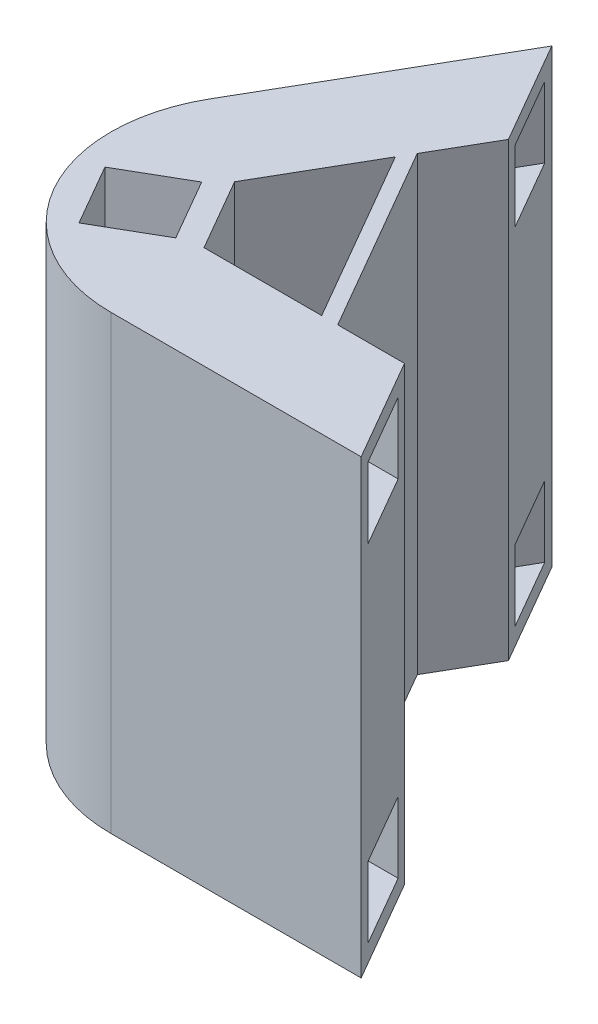
ISO-10303-21;
HEADER;
FILE_DESCRIPTION(('STEP AP214'),'2;1');
FILE_NAME('part.step','',(''),(''),'','','');
FILE_SCHEMA(('AUTOMOTIVE_DESIGN { 1 0 10303 214 1 1 1 1 }'));
ENDSEC;
DATA;
#1=APPLICATION_CONTEXT('core data for automotive mechanical design processes');
#2=APPLICATION_PROTOCOL_DEFINITION('international standard','automotive_design',2000,#1);
#3=PRODUCT_CONTEXT('',#1,'mechanical');
#4=PRODUCT('Part','Part','',(#3));
#5=PRODUCT_RELATED_PRODUCT_CATEGORY('part','',(#4));
#6=PRODUCT_DEFINITION_FORMATION('','',#4);
#7=PRODUCT_DEFINITION_CONTEXT('part definition',#1,'design');
#8=PRODUCT_DEFINITION('design','',#6,#7);
#9=PRODUCT_DEFINITION_SHAPE('','',#8);
#10=(LENGTH_UNIT() NAMED_UNIT(*) SI_UNIT(.MILLI.,.METRE.));
#11=(NAMED_UNIT(*) PLANE_ANGLE_UNIT() SI_UNIT($,.RADIAN.));
#12=(NAMED_UNIT(*) SI_UNIT($,.STERADIAN.) SOLID_ANGLE_UNIT());
#13=UNCERTAINTY_MEASURE_WITH_UNIT(LENGTH_MEASURE(1.E-05),#10,'distance_accuracy_value','');
#14=(GEOMETRIC_REPRESENTATION_CONTEXT(3) GLOBAL_UNCERTAINTY_ASSIGNED_CONTEXT((#13)) GLOBAL_UNIT_ASSIGNED_CONTEXT((#10,
#11,#12)) REPRESENTATION_CONTEXT('',''));
#15=CARTESIAN_POINT('',(0.,0.,0.));
#16=DIRECTION('',(0.,0.,1.));
#17=DIRECTION('',(1.,0.,0.));
#18=AXIS2_PLACEMENT_3D('',#15,#16,#17);
#19=CARTESIAN_POINT('',(132.950773216421,-434.866677038872,-29.5301270189221));
#20=DIRECTION('',(0.,0.,-1.));
#21=DIRECTION('',(-1.,0.,0.));
#22=AXIS2_PLACEMENT_3D('',#19,#20,#21);
#23=PLANE('',#22);
#24=DIRECTION('',(0.,-1.,0.));
#25=VECTOR('',#24,1.);
#26=CARTESIAN_POINT('',(113.725009252406,193.763403112973,-29.5301270189222));
#27=LINE('',#26,#25);
#28=CARTESIAN_POINT('',(113.725009252406,130.,-29.5301270189221));
#29=VERTEX_POINT('',#28);
#30=CARTESIAN_POINT('',(113.725009252406,0.,-29.5301270189222));
#31=VERTEX_POINT('',#30);
#32=EDGE_CURVE('E270',#29,#31,#27,.T.);
#33=ORIENTED_EDGE('',*,*,#32,.F.);
#34=DIRECTION('',(1.,0.,0.));
#35=VECTOR('',#34,1.);
#36=CARTESIAN_POINT('',(0.,130.,-29.5301270189222));
#37=LINE('',#36,#35);
#38=CARTESIAN_POINT('',(132.950773216421,130.,-29.5301270189221));
#39=VERTEX_POINT('',#38);
#40=EDGE_CURVE('E281',#29,#39,#37,.T.);
#41=ORIENTED_EDGE('',*,*,#40,.T.);
#42=DIRECTION('',(0.,1.,0.));
#43=VECTOR('',#42,1.);
#44=CARTESIAN_POINT('',(132.950773216421,-434.866677038872,-29.5301270189221));
#45=LINE('',#44,#43);
#46=CARTESIAN_POINT('',(132.950773216421,0.,-29.5301270189221));
#47=VERTEX_POINT('',#46);
#48=EDGE_CURVE('E252',#47,#39,#45,.T.);
#49=ORIENTED_EDGE('',*,*,#48,.F.);
#50=DIRECTION('',(1.,0.,0.));
#51=VECTOR('',#50,1.);
#52=CARTESIAN_POINT('',(0.,0.,-29.5301270189222));
#53=LINE('',#52,#51);
#54=EDGE_CURVE('E41',#31,#47,#53,.T.);
#55=ORIENTED_EDGE('',*,*,#54,.F.);
#56=EDGE_LOOP('',(#33,#41,#49,#55));
#57=FACE_BOUND('',#56,.T.);
#58=ADVANCED_FACE('F33',(#57),#23,.T.);
#59=CARTESIAN_POINT('',(63.1817133240967,-434.866677038872,-50.3736835487436));
#60=DIRECTION('',(0.866025403784439,0.,0.5));
#61=DIRECTION('',(0.5,0.,-0.866025403784439));
#62=AXIS2_PLACEMENT_3D('',#59,#60,#61);
#63=PLANE('',#62);
#64=DIRECTION('',(0.,-1.,0.));
#65=VECTOR('',#64,1.);
#66=CARTESIAN_POINT('',(82.4363448015707,193.763403112973,-83.7236835487436));
#67=LINE('',#66,#65);
#68=CARTESIAN_POINT('',(82.4363448015707,130.,-83.7236835487436));
#69=VERTEX_POINT('',#68);
#70=CARTESIAN_POINT('',(82.4363448015707,0.,-83.7236835487436));
#71=VERTEX_POINT('',#70);
#72=EDGE_CURVE('E261',#69,#71,#67,.T.);
#73=ORIENTED_EDGE('',*,*,#72,.T.);
#74=DIRECTION('',(-0.5,0.,0.866025403784439));
#75=VECTOR('',#74,1.);
#76=CARTESIAN_POINT('',(25.5738401753674,0.,14.7650635094608));
#77=LINE('',#76,#75);
#78=CARTESIAN_POINT('',(92.049226783578,0.,-100.373683548744));
#79=VERTEX_POINT('',#78);
#80=EDGE_CURVE('E472',#79,#71,#77,.T.);
#81=ORIENTED_EDGE('',*,*,#80,.F.);
#82=DIRECTION('',(0.,1.,0.));
#83=VECTOR('',#82,1.);
#84=CARTESIAN_POINT('',(92.049226783578,-434.866677038872,-100.373683548744));
#85=LINE('',#84,#83);
#86=CARTESIAN_POINT('',(92.049226783578,130.,-100.373683548744));
#87=VERTEX_POINT('',#86);
#88=EDGE_CURVE('E267',#79,#87,#85,.T.);
#89=ORIENTED_EDGE('',*,*,#88,.T.);
#90=DIRECTION('',(-0.5,0.,0.866025403784439));
#91=VECTOR('',#90,1.);
#92=CARTESIAN_POINT('',(25.5738401753674,130.,14.7650635094608));
#93=LINE('',#92,#91);
#94=EDGE_CURVE('E251',#87,#69,#93,.T.);
#95=ORIENTED_EDGE('',*,*,#94,.T.);
#96=EDGE_LOOP('',(#73,#81,#89,#95));
#97=FACE_BOUND('',#96,.T.);
#98=ADVANCED_FACE('F519',(#97),#63,.T.);
#99=CARTESIAN_POINT('',(74.9999999999997,130.,-129.903810567666));
#100=DIRECTION('',(-0.86602540378444,0.,0.499999999999998));
#101=DIRECTION('',(0.499999999999998,0.,0.86602540378444));
#102=AXIS2_PLACEMENT_3D('',#99,#100,#101);
#103=PLANE('',#102);
#104=DIRECTION('',(-0.499999999999998,0.,-0.86602540378444));
#105=VECTOR('',#104,1.);
#106=CARTESIAN_POINT('',(74.9999999999997,104.6,-129.903810567666));
#107=LINE('',#106,#105);
#108=CARTESIAN_POINT('',(89.5492267835782,104.6,-104.703810567666));
#109=VERTEX_POINT('',#108);
#110=CARTESIAN_POINT('',(77.7712812921099,104.6,-125.103810567666));
#111=VERTEX_POINT('',#110);
#112=EDGE_CURVE('E461',#109,#111,#107,.T.);
#113=ORIENTED_EDGE('',*,*,#112,.F.);
#114=DIRECTION('',(0.,1.,0.));
#115=VECTOR('',#114,1.);
#116=CARTESIAN_POINT('',(89.5492267835782,130.,-104.703810567666));
#117=LINE('',#116,#115);
#118=CARTESIAN_POINT('',(89.5492267835782,125.,-104.703810567666));
#119=VERTEX_POINT('',#118);
#120=EDGE_CURVE('E458',#109,#119,#117,.T.);
#121=ORIENTED_EDGE('',*,*,#120,.T.);
#122=DIRECTION('',(-0.499999999999998,0.,-0.86602540378444));
#123=VECTOR('',#122,1.);
#124=CARTESIAN_POINT('',(74.9999999999997,125.,-129.903810567666));
#125=LINE('',#124,#123);
#126=CARTESIAN_POINT('',(77.7712812921099,125.,-125.103810567666));
#127=VERTEX_POINT('',#126);
#128=EDGE_CURVE('E452',#119,#127,#125,.T.);
#129=ORIENTED_EDGE('',*,*,#128,.T.);
#130=DIRECTION('',(0.,-1.,0.));
#131=VECTOR('',#130,1.);
#132=CARTESIAN_POINT('',(77.7712812921099,130.,-125.103810567666));
#133=LINE('',#132,#131);
#134=EDGE_CURVE('E455',#127,#111,#133,.T.);
#135=ORIENTED_EDGE('',*,*,#134,.T.);
#136=EDGE_LOOP('',(#113,#121,#129,#135));
#137=FACE_BOUND('',#136,.T.);
#138=DIRECTION('',(0.499999999999998,0.,0.86602540378444));
#139=VECTOR('',#138,1.);
#140=CARTESIAN_POINT('',(74.9999999999997,25.4,-129.903810567666));
#141=LINE('',#140,#139);
#142=CARTESIAN_POINT('',(77.7712812921099,25.4,-125.103810567666));
#143=VERTEX_POINT('',#142);
#144=CARTESIAN_POINT('',(89.5492267835782,25.4,-104.703810567666));
#145=VERTEX_POINT('',#144);
#146=EDGE_CURVE('E439',#143,#145,#141,.T.);
#147=ORIENTED_EDGE('',*,*,#146,.F.);
#148=DIRECTION('',(0.,1.,0.));
#149=VECTOR('',#148,1.);
#150=CARTESIAN_POINT('',(77.7712812921099,130.,-125.103810567666));
#151=LINE('',#150,#149);
#152=CARTESIAN_POINT('',(77.7712812921099,5.,-125.103810567666));
#153=VERTEX_POINT('',#152);
#154=EDGE_CURVE('E437',#153,#143,#151,.T.);
#155=ORIENTED_EDGE('',*,*,#154,.F.);
#156=DIRECTION('',(0.499999999999998,0.,0.86602540378444));
#157=VECTOR('',#156,1.);
#158=CARTESIAN_POINT('',(74.9999999999997,5.,-129.903810567666));
#159=LINE('',#158,#157);
#160=CARTESIAN_POINT('',(89.5492267835782,5.,-104.703810567666));
#161=VERTEX_POINT('',#160);
#162=EDGE_CURVE('E431',#153,#161,#159,.T.);
#163=ORIENTED_EDGE('',*,*,#162,.T.);
#164=DIRECTION('',(0.,-1.,0.));
#165=VECTOR('',#164,1.);
#166=CARTESIAN_POINT('',(89.5492267835782,130.,-104.703810567666));
#167=LINE('',#166,#165);
#168=EDGE_CURVE('E434',#145,#161,#167,.T.);
#169=ORIENTED_EDGE('',*,*,#168,.F.);
#170=EDGE_LOOP('',(#147,#155,#163,#169));
#171=FACE_BOUND('',#170,.T.);
#172=ORIENTED_EDGE('',*,*,#88,.F.);
#173=DIRECTION('',(-0.499999999999998,0.,-0.86602540378444));
#174=VECTOR('',#173,1.);
#175=CARTESIAN_POINT('',(74.9999999999997,0.,-129.903810567666));
#176=LINE('',#175,#174);
#177=CARTESIAN_POINT('',(74.9999999999997,0.,-129.903810567666));
#178=VERTEX_POINT('',#177);
#179=EDGE_CURVE('E413',#79,#178,#176,.T.);
#180=ORIENTED_EDGE('',*,*,#179,.T.);
#181=DIRECTION('',(0.,-1.,0.));
#182=VECTOR('',#181,1.);
#183=CARTESIAN_POINT('',(74.9999999999997,130.,-129.903810567666));
#184=LINE('',#183,#182);
#185=CARTESIAN_POINT('',(74.9999999999997,130.,-129.903810567666));
#186=VERTEX_POINT('',#185);
#187=EDGE_CURVE('E408',#186,#178,#184,.T.);
#188=ORIENTED_EDGE('',*,*,#187,.F.);
#189=DIRECTION('',(-0.499999999999998,0.,-0.86602540378444));
#190=VECTOR('',#189,1.);
#191=CARTESIAN_POINT('',(74.9999999999997,130.,-129.903810567666));
#192=LINE('',#191,#190);
#193=EDGE_CURVE('E404',#87,#186,#192,.T.);
#194=ORIENTED_EDGE('',*,*,#193,.F.);
#195=EDGE_LOOP('',(#172,#180,#188,#194));
#196=FACE_BOUND('',#195,.T.);
#197=ADVANCED_FACE('F508',(#137,#171,#196),#103,.F.);
#198=CARTESIAN_POINT('',(0.,130.,0.));
#199=DIRECTION('',(0.,-1.,0.));
#200=DIRECTION('',(0.,0.,-1.));
#201=AXIS2_PLACEMENT_3D('',#198,#199,#200);
#202=PLANE('',#201);
#203=ORIENTED_EDGE('',*,*,#40,.F.);
#204=DIRECTION('',(-0.5,0.,-0.866025403784439));
#205=VECTOR('',#204,1.);
#206=CARTESIAN_POINT('',(82.4363448015707,130.,-83.7236835487436));
#207=LINE('',#206,#205);
#208=EDGE_CURVE('E265',#29,#69,#207,.T.);
#209=ORIENTED_EDGE('',*,*,#208,.T.);
#210=ORIENTED_EDGE('',*,*,#94,.F.);
#211=ORIENTED_EDGE('',*,*,#193,.T.);
#212=DIRECTION('',(-0.499999999999998,0.,0.86602540378444));
#213=VECTOR('',#212,1.);
#214=CARTESIAN_POINT('',(0.,130.,0.));
#215=LINE('',#214,#213);
#216=CARTESIAN_POINT('',(38.9711431702994,130.,-67.4999999999999));
#217=VERTEX_POINT('',#216);
#218=EDGE_CURVE('E398',#186,#217,#215,.T.);
#219=ORIENTED_EDGE('',*,*,#218,.T.);
#220=CARTESIAN_POINT('',(77.9422863405992,130.,-45.));
#221=DIRECTION('',(0.,-1.,0.));
#222=DIRECTION('',(0.,0.,-1.));
#223=AXIS2_PLACEMENT_3D('',#220,#221,#222);
#224=CIRCLE('',#223,45.);
#225=CARTESIAN_POINT('',(77.9422863405992,130.,0.));
#226=VERTEX_POINT('',#225);
#227=EDGE_CURVE('E470',#217,#226,#224,.F.);
#228=ORIENTED_EDGE('',*,*,#227,.T.);
#229=DIRECTION('',(1.,0.,0.));
#230=VECTOR('',#229,1.);
#231=CARTESIAN_POINT('',(0.,130.,0.));
#232=LINE('',#231,#230);
#233=CARTESIAN_POINT('',(149.999999999999,130.,0.));
#234=VERTEX_POINT('',#233);
#235=EDGE_CURVE('E401',#226,#234,#232,.T.);
#236=ORIENTED_EDGE('',*,*,#235,.T.);
#237=EDGE_CURVE('E405',#234,#39,#192,.T.);
#238=ORIENTED_EDGE('',*,*,#237,.T.);
#239=EDGE_LOOP('',(#203,#209,#210,#211,#219,#228,#236,#238));
#240=FACE_BOUND('',#239,.T.);
#241=DIRECTION('',(-0.5,0.,-0.866025403784439));
#242=VECTOR('',#241,1.);
#243=CARTESIAN_POINT('',(68.715583945428,130.,-27.8950153969413));
#244=LINE('',#243,#242);
#245=CARTESIAN_POINT('',(68.715583945428,130.,-27.8950153969413));
#246=VERTEX_POINT('',#245);
#247=CARTESIAN_POINT('',(58.515583945428,130.,-45.5619336341438));
#248=VERTEX_POINT('',#247);
#249=EDGE_CURVE('E285',#246,#248,#244,.T.);
#250=ORIENTED_EDGE('',*,*,#249,.F.);
#251=DIRECTION('',(0.866025403784439,0.,-0.5));
#252=VECTOR('',#251,1.);
#253=CARTESIAN_POINT('',(68.715583945428,130.,-27.8950153969413));
#254=LINE('',#253,#252);
#255=CARTESIAN_POINT('',(51.0486657082254,130.,-17.6950153969413));
#256=VERTEX_POINT('',#255);
#257=EDGE_CURVE('E293',#256,#246,#254,.T.);
#258=ORIENTED_EDGE('',*,*,#257,.F.);
#259=DIRECTION('',(0.5,0.,0.866025403784439));
#260=VECTOR('',#259,1.);
#261=CARTESIAN_POINT('',(51.0486657082254,130.,-17.6950153969413));
#262=LINE('',#261,#260);
#263=CARTESIAN_POINT('',(40.8486657082254,130.,-35.3619336341438));
#264=VERTEX_POINT('',#263);
#265=EDGE_CURVE('E290',#264,#256,#262,.T.);
#266=ORIENTED_EDGE('',*,*,#265,.F.);
#267=DIRECTION('',(-0.866025403784438,0.,0.5));
#268=VECTOR('',#267,1.);
#269=CARTESIAN_POINT('',(58.515583945428,130.,-45.5619336341438));
#270=LINE('',#269,#268);
#271=EDGE_CURVE('E287',#248,#264,#270,.T.);
#272=ORIENTED_EDGE('',*,*,#271,.F.);
#273=EDGE_LOOP('',(#250,#258,#266,#272));
#274=FACE_BOUND('',#273,.T.);
#275=CARTESIAN_POINT('',(75.2157462974583,130.,-29.5301270189222));
#276=VERTEX_POINT('',#275);
#277=CARTESIAN_POINT('',(109.106207098889,130.,-29.5301270189222));
#278=VERTEX_POINT('',#277);
#279=EDGE_CURVE('E282',#276,#278,#37,.T.);
#280=ORIENTED_EDGE('',*,*,#279,.F.);
#281=DIRECTION('',(0.5,0.,0.866025403784439));
#282=VECTOR('',#281,1.);
#283=CARTESIAN_POINT('',(69.1987298107776,130.,-39.9519052838326));
#284=LINE('',#283,#282);
#285=CARTESIAN_POINT('',(63.1817133240967,130.,-50.3736835487436));
#286=VERTEX_POINT('',#285);
#287=EDGE_CURVE('E247',#286,#276,#284,.T.);
#288=ORIENTED_EDGE('',*,*,#287,.F.);
#289=CARTESIAN_POINT('',(80.1269437248122,130.,-79.7236835487436));
#290=VERTEX_POINT('',#289);
#291=EDGE_CURVE('E241',#290,#286,#93,.T.);
#292=ORIENTED_EDGE('',*,*,#291,.F.);
#293=DIRECTION('',(0.5,0.,0.866025403784439));
#294=VECTOR('',#293,1.);
#295=CARTESIAN_POINT('',(109.106207098889,130.,-29.5301270189222));
#296=LINE('',#295,#294);
#297=EDGE_CURVE('E246',#290,#278,#296,.T.);
#298=ORIENTED_EDGE('',*,*,#297,.T.);
#299=EDGE_LOOP('',(#280,#288,#292,#298));
#300=FACE_BOUND('',#299,.T.);
#301=ADVANCED_FACE('F244',(#240,#274,#300),#202,.F.);
#302=CARTESIAN_POINT('',(0.,0.,0.));
#303=DIRECTION('',(0.,-1.,0.));
#304=DIRECTION('',(0.,0.,-1.));
#305=AXIS2_PLACEMENT_3D('',#302,#303,#304);
#306=PLANE('',#305);
#307=CARTESIAN_POINT('',(75.2157462974583,0.,-29.5301270189222));
#308=VERTEX_POINT('',#307);
#309=CARTESIAN_POINT('',(109.106207098889,0.,-29.5301270189222));
#310=VERTEX_POINT('',#309);
#311=EDGE_CURVE('E11',#308,#310,#53,.T.);
#312=ORIENTED_EDGE('',*,*,#311,.T.);
#313=DIRECTION('',(-0.5,0.,-0.866025403784439));
#314=VECTOR('',#313,1.);
#315=CARTESIAN_POINT('',(109.106207098889,0.,-29.5301270189222));
#316=LINE('',#315,#314);
#317=CARTESIAN_POINT('',(80.1269437248122,0.,-79.7236835487437));
#318=VERTEX_POINT('',#317);
#319=EDGE_CURVE('E514',#310,#318,#316,.T.);
#320=ORIENTED_EDGE('',*,*,#319,.T.);
#321=CARTESIAN_POINT('',(63.1817133240967,0.,-50.3736835487436));
#322=VERTEX_POINT('',#321);
#323=EDGE_CURVE('E257',#318,#322,#77,.T.);
#324=ORIENTED_EDGE('',*,*,#323,.T.);
#325=DIRECTION('',(0.5,0.,0.866025403784439));
#326=VECTOR('',#325,1.);
#327=CARTESIAN_POINT('',(69.1987298107776,0.,-39.9519052838326));
#328=LINE('',#327,#326);
#329=EDGE_CURVE('E474',#322,#308,#328,.T.);
#330=ORIENTED_EDGE('',*,*,#329,.T.);
#331=EDGE_LOOP('',(#312,#320,#324,#330));
#332=FACE_BOUND('',#331,.T.);
#333=DIRECTION('',(0.866025403784439,0.,-0.5));
#334=VECTOR('',#333,1.);
#335=CARTESIAN_POINT('',(68.715583945428,0.,-27.8950153969413));
#336=LINE('',#335,#334);
#337=CARTESIAN_POINT('',(51.0486657082254,0.,-17.6950153969413));
#338=VERTEX_POINT('',#337);
#339=CARTESIAN_POINT('',(68.715583945428,0.,-27.8950153969413));
#340=VERTEX_POINT('',#339);
#341=EDGE_CURVE('E288',#338,#340,#336,.T.);
#342=ORIENTED_EDGE('',*,*,#341,.T.);
#343=DIRECTION('',(-0.5,0.,-0.866025403784439));
#344=VECTOR('',#343,1.);
#345=CARTESIAN_POINT('',(68.715583945428,0.,-27.8950153969413));
#346=LINE('',#345,#344);
#347=CARTESIAN_POINT('',(58.515583945428,0.,-45.5619336341438));
#348=VERTEX_POINT('',#347);
#349=EDGE_CURVE('E284',#340,#348,#346,.T.);
#350=ORIENTED_EDGE('',*,*,#349,.T.);
#351=DIRECTION('',(-0.866025403784438,0.,0.5));
#352=VECTOR('',#351,1.);
#353=CARTESIAN_POINT('',(58.515583945428,0.,-45.5619336341438));
#354=LINE('',#353,#352);
#355=CARTESIAN_POINT('',(40.8486657082254,0.,-35.3619336341438));
#356=VERTEX_POINT('',#355);
#357=EDGE_CURVE('E298',#348,#356,#354,.T.);
#358=ORIENTED_EDGE('',*,*,#357,.T.);
#359=DIRECTION('',(0.5,0.,0.866025403784439));
#360=VECTOR('',#359,1.);
#361=CARTESIAN_POINT('',(51.0486657082254,0.,-17.6950153969413));
#362=LINE('',#361,#360);
#363=EDGE_CURVE('E301',#356,#338,#362,.T.);
#364=ORIENTED_EDGE('',*,*,#363,.T.);
#365=EDGE_LOOP('',(#342,#350,#358,#364));
#366=FACE_BOUND('',#365,.T.);
#367=DIRECTION('',(0.5,0.,0.866025403784439));
#368=VECTOR('',#367,1.);
#369=CARTESIAN_POINT('',(82.4363448015707,0.,-83.7236835487436));
#370=LINE('',#369,#368);
#371=EDGE_CURVE('E484',#71,#31,#370,.T.);
#372=ORIENTED_EDGE('',*,*,#371,.T.);
#373=ORIENTED_EDGE('',*,*,#54,.T.);
#374=CARTESIAN_POINT('',(149.999999999999,0.,0.));
#375=VERTEX_POINT('',#374);
#376=EDGE_CURVE('E402',#375,#47,#176,.T.);
#377=ORIENTED_EDGE('',*,*,#376,.F.);
#378=DIRECTION('',(1.,0.,0.));
#379=VECTOR('',#378,1.);
#380=CARTESIAN_POINT('',(0.,0.,0.));
#381=LINE('',#380,#379);
#382=CARTESIAN_POINT('',(77.9422863405992,0.,0.));
#383=VERTEX_POINT('',#382);
#384=EDGE_CURVE('E411',#383,#375,#381,.T.);
#385=ORIENTED_EDGE('',*,*,#384,.F.);
#386=CARTESIAN_POINT('',(77.9422863405992,0.,-45.));
#387=DIRECTION('',(0.,-1.,0.));
#388=DIRECTION('',(0.,0.,-1.));
#389=AXIS2_PLACEMENT_3D('',#386,#387,#388);
#390=CIRCLE('',#389,45.);
#391=CARTESIAN_POINT('',(38.9711431702994,0.,-67.4999999999999));
#392=VERTEX_POINT('',#391);
#393=EDGE_CURVE('E466',#383,#392,#390,.T.);
#394=ORIENTED_EDGE('',*,*,#393,.T.);
#395=DIRECTION('',(-0.499999999999998,0.,0.86602540378444));
#396=VECTOR('',#395,1.);
#397=CARTESIAN_POINT('',(0.,0.,0.));
#398=LINE('',#397,#396);
#399=EDGE_CURVE('E378',#178,#392,#398,.T.);
#400=ORIENTED_EDGE('',*,*,#399,.F.);
#401=ORIENTED_EDGE('',*,*,#179,.F.);
#402=ORIENTED_EDGE('',*,*,#80,.T.);
#403=EDGE_LOOP('',(#372,#373,#377,#385,#394,#400,#401,#402));
#404=FACE_BOUND('',#403,.T.);
#405=ADVANCED_FACE('F481',(#332,#366,#404),#306,.T.);
#406=DIRECTION('',(-0.499999999999998,0.,-0.86602540378444));
#407=VECTOR('',#406,1.);
#408=CARTESIAN_POINT('',(74.9999999999997,104.6,-129.903810567666));
#409=LINE('',#408,#407);
#410=CARTESIAN_POINT('',(147.228718707889,104.6,-4.8));
#411=VERTEX_POINT('',#410);
#412=CARTESIAN_POINT('',(135.450773216421,104.6,-25.2));
#413=VERTEX_POINT('',#412);
#414=EDGE_CURVE('E450',#411,#413,#409,.T.);
#415=ORIENTED_EDGE('',*,*,#414,.F.);
#416=DIRECTION('',(0.,1.,0.));
#417=VECTOR('',#416,1.);
#418=CARTESIAN_POINT('',(147.228718707889,130.,-4.8));
#419=LINE('',#418,#417);
#420=CARTESIAN_POINT('',(147.228718707889,125.,-4.8));
#421=VERTEX_POINT('',#420);
#422=EDGE_CURVE('E444',#411,#421,#419,.T.);
#423=ORIENTED_EDGE('',*,*,#422,.T.);
#424=DIRECTION('',(-0.499999999999998,0.,-0.86602540378444));
#425=VECTOR('',#424,1.);
#426=CARTESIAN_POINT('',(74.9999999999997,125.,-129.903810567666));
#427=LINE('',#426,#425);
#428=CARTESIAN_POINT('',(135.450773216421,125.,-25.2));
#429=VERTEX_POINT('',#428);
#430=EDGE_CURVE('E441',#421,#429,#427,.T.);
#431=ORIENTED_EDGE('',*,*,#430,.T.);
#432=DIRECTION('',(0.,-1.,0.));
#433=VECTOR('',#432,1.);
#434=CARTESIAN_POINT('',(135.450773216421,130.,-25.2));
#435=LINE('',#434,#433);
#436=EDGE_CURVE('E447',#429,#413,#435,.T.);
#437=ORIENTED_EDGE('',*,*,#436,.T.);
#438=EDGE_LOOP('',(#415,#423,#431,#437));
#439=FACE_BOUND('',#438,.T.);
#440=DIRECTION('',(0.499999999999998,0.,0.86602540378444));
#441=VECTOR('',#440,1.);
#442=CARTESIAN_POINT('',(74.9999999999997,25.4,-129.903810567666));
#443=LINE('',#442,#441);
#444=CARTESIAN_POINT('',(135.450773216421,25.4,-25.2));
#445=VERTEX_POINT('',#444);
#446=CARTESIAN_POINT('',(147.228718707889,25.4,-4.8));
#447=VERTEX_POINT('',#446);
#448=EDGE_CURVE('E429',#445,#447,#443,.T.);
#449=ORIENTED_EDGE('',*,*,#448,.F.);
#450=DIRECTION('',(0.,1.,0.));
#451=VECTOR('',#450,1.);
#452=CARTESIAN_POINT('',(135.450773216421,130.,-25.2));
#453=LINE('',#452,#451);
#454=CARTESIAN_POINT('',(135.450773216421,5.,-25.2));
#455=VERTEX_POINT('',#454);
#456=EDGE_CURVE('E424',#455,#445,#453,.T.);
#457=ORIENTED_EDGE('',*,*,#456,.F.);
#458=DIRECTION('',(0.499999999999998,0.,0.86602540378444));
#459=VECTOR('',#458,1.);
#460=CARTESIAN_POINT('',(74.9999999999997,5.,-129.903810567666));
#461=LINE('',#460,#459);
#462=CARTESIAN_POINT('',(147.228718707889,5.,-4.8));
#463=VERTEX_POINT('',#462);
#464=EDGE_CURVE('E421',#455,#463,#461,.T.);
#465=ORIENTED_EDGE('',*,*,#464,.T.);
#466=DIRECTION('',(0.,-1.,0.));
#467=VECTOR('',#466,1.);
#468=CARTESIAN_POINT('',(147.228718707889,130.,-4.8));
#469=LINE('',#468,#467);
#470=EDGE_CURVE('E426',#447,#463,#469,.T.);
#471=ORIENTED_EDGE('',*,*,#470,.F.);
#472=EDGE_LOOP('',(#449,#457,#465,#471));
#473=FACE_BOUND('',#472,.T.);
#474=ORIENTED_EDGE('',*,*,#376,.T.);
#475=ORIENTED_EDGE('',*,*,#48,.T.);
#476=ORIENTED_EDGE('',*,*,#237,.F.);
#477=DIRECTION('',(0.,-1.,0.));
#478=VECTOR('',#477,1.);
#479=CARTESIAN_POINT('',(149.999999999999,130.,0.));
#480=LINE('',#479,#478);
#481=EDGE_CURVE('E418',#234,#375,#480,.T.);
#482=ORIENTED_EDGE('',*,*,#481,.T.);
#483=EDGE_LOOP('',(#474,#475,#476,#482));
#484=FACE_BOUND('',#483,.T.);
#485=ADVANCED_FACE('F487',(#439,#473,#484),#103,.F.);
#486=CARTESIAN_POINT('',(0.,130.,0.));
#487=DIRECTION('',(0.86602540378444,0.,0.499999999999998));
#488=DIRECTION('',(0.499999999999998,0.,-0.86602540378444));
#489=AXIS2_PLACEMENT_3D('',#486,#487,#488);
#490=PLANE('',#489);
#491=ORIENTED_EDGE('',*,*,#399,.T.);
#492=DIRECTION('',(0.,-1.,0.));
#493=VECTOR('',#492,1.);
#494=CARTESIAN_POINT('',(38.9711431702994,130.,-67.4999999999999));
#495=LINE('',#494,#493);
#496=EDGE_CURVE('E468',#392,#217,#495,.F.);
#497=ORIENTED_EDGE('',*,*,#496,.T.);
#498=ORIENTED_EDGE('',*,*,#218,.F.);
#499=ORIENTED_EDGE('',*,*,#187,.T.);
#500=EDGE_LOOP('',(#491,#497,#498,#499));
#501=FACE_BOUND('',#500,.T.);
#502=ADVANCED_FACE('F498',(#501),#490,.F.);
#503=CARTESIAN_POINT('',(0.,130.,0.));
#504=DIRECTION('',(0.,0.,-1.));
#505=DIRECTION('',(-1.,0.,0.));
#506=AXIS2_PLACEMENT_3D('',#503,#504,#505);
#507=PLANE('',#506);
#508=ORIENTED_EDGE('',*,*,#235,.F.);
#509=DIRECTION('',(0.,-1.,0.));
#510=VECTOR('',#509,1.);
#511=CARTESIAN_POINT('',(77.9422863405992,130.,0.));
#512=LINE('',#511,#510);
#513=EDGE_CURVE('E463',#226,#383,#512,.T.);
#514=ORIENTED_EDGE('',*,*,#513,.T.);
#515=ORIENTED_EDGE('',*,*,#384,.T.);
#516=ORIENTED_EDGE('',*,*,#481,.F.);
#517=EDGE_LOOP('',(#508,#514,#515,#516));
#518=FACE_BOUND('',#517,.T.);
#519=ADVANCED_FACE('F491',(#518),#507,.F.);
#520=CARTESIAN_POINT('',(73.8,25.4,-4.8));
#521=DIRECTION('',(0.,0.,-1.));
#522=DIRECTION('',(-1.,0.,0.));
#523=AXIS2_PLACEMENT_3D('',#520,#521,#522);
#524=PLANE('',#523);
#525=ORIENTED_EDGE('',*,*,#470,.T.);
#526=DIRECTION('',(1.,0.,0.));
#527=VECTOR('',#526,1.);
#528=CARTESIAN_POINT('',(73.8,5.,-4.8));
#529=LINE('',#528,#527);
#530=CARTESIAN_POINT('',(73.8,5.,-4.8));
#531=VERTEX_POINT('',#530);
#532=EDGE_CURVE('E391',#531,#463,#529,.T.);
#533=ORIENTED_EDGE('',*,*,#532,.F.);
#534=DIRECTION('',(0.,-1.,0.));
#535=VECTOR('',#534,1.);
#536=CARTESIAN_POINT('',(73.8,25.4,-4.8));
#537=LINE('',#536,#535);
#538=CARTESIAN_POINT('',(73.8,25.4,-4.8));
#539=VERTEX_POINT('',#538);
#540=EDGE_CURVE('E370',#539,#531,#537,.T.);
#541=ORIENTED_EDGE('',*,*,#540,.F.);
#542=DIRECTION('',(1.,0.,0.));
#543=VECTOR('',#542,1.);
#544=CARTESIAN_POINT('',(73.8,25.4,-4.8));
#545=LINE('',#544,#543);
#546=EDGE_CURVE('E382',#539,#447,#545,.T.);
#547=ORIENTED_EDGE('',*,*,#546,.T.);
#548=EDGE_LOOP('',(#525,#533,#541,#547));
#549=FACE_BOUND('',#548,.T.);
#550=ADVANCED_FACE('F632',(#549),#524,.T.);
#551=CARTESIAN_POINT('',(73.8,25.4,-25.2));
#552=DIRECTION('',(0.,0.,1.));
#553=DIRECTION('',(1.,0.,0.));
#554=AXIS2_PLACEMENT_3D('',#551,#552,#553);
#555=PLANE('',#554);
#556=ORIENTED_EDGE('',*,*,#456,.T.);
#557=DIRECTION('',(-1.,0.,0.));
#558=VECTOR('',#557,1.);
#559=CARTESIAN_POINT('',(73.8,25.4,-25.2));
#560=LINE('',#559,#558);
#561=CARTESIAN_POINT('',(73.8,25.4,-25.2));
#562=VERTEX_POINT('',#561);
#563=EDGE_CURVE('E386',#445,#562,#560,.T.);
#564=ORIENTED_EDGE('',*,*,#563,.T.);
#565=DIRECTION('',(0.,-1.,0.));
#566=VECTOR('',#565,1.);
#567=CARTESIAN_POINT('',(73.8,25.4,-25.2));
#568=LINE('',#567,#566);
#569=CARTESIAN_POINT('',(73.8,5.,-25.2));
#570=VERTEX_POINT('',#569);
#571=EDGE_CURVE('E388',#562,#570,#568,.T.);
#572=ORIENTED_EDGE('',*,*,#571,.T.);
#573=DIRECTION('',(-1.,0.,0.));
#574=VECTOR('',#573,1.);
#575=CARTESIAN_POINT('',(73.8,5.,-25.2));
#576=LINE('',#575,#574);
#577=EDGE_CURVE('E383',#455,#570,#576,.T.);
#578=ORIENTED_EDGE('',*,*,#577,.F.);
#579=EDGE_LOOP('',(#556,#564,#572,#578));
#580=FACE_BOUND('',#579,.T.);
#581=ADVANCED_FACE('F625',(#580),#555,.T.);
#582=CARTESIAN_POINT('',(0.,25.4,0.));
#583=DIRECTION('',(0.,-1.,0.));
#584=DIRECTION('',(0.,0.,-1.));
#585=AXIS2_PLACEMENT_3D('',#582,#583,#584);
#586=PLANE('',#585);
#587=ORIENTED_EDGE('',*,*,#448,.T.);
#588=ORIENTED_EDGE('',*,*,#546,.F.);
#589=DIRECTION('',(0.,0.,1.));
#590=VECTOR('',#589,1.);
#591=CARTESIAN_POINT('',(73.8,25.4,-4.8));
#592=LINE('',#591,#590);
#593=EDGE_CURVE('E379',#562,#539,#592,.T.);
#594=ORIENTED_EDGE('',*,*,#593,.F.);
#595=ORIENTED_EDGE('',*,*,#563,.F.);
#596=EDGE_LOOP('',(#587,#588,#594,#595));
#597=FACE_BOUND('',#596,.T.);
#598=ADVANCED_FACE('F621',(#597),#586,.T.);
#599=CARTESIAN_POINT('',(0.,5.,0.));
#600=DIRECTION('',(0.,-1.,0.));
#601=DIRECTION('',(0.,0.,-1.));
#602=AXIS2_PLACEMENT_3D('',#599,#600,#601);
#603=PLANE('',#602);
#604=ORIENTED_EDGE('',*,*,#577,.T.);
#605=DIRECTION('',(0.,0.,1.));
#606=VECTOR('',#605,1.);
#607=CARTESIAN_POINT('',(73.8,5.,-4.8));
#608=LINE('',#607,#606);
#609=EDGE_CURVE('E338',#570,#531,#608,.T.);
#610=ORIENTED_EDGE('',*,*,#609,.T.);
#611=ORIENTED_EDGE('',*,*,#532,.T.);
#612=ORIENTED_EDGE('',*,*,#464,.F.);
#613=EDGE_LOOP('',(#604,#610,#611,#612));
#614=FACE_BOUND('',#613,.T.);
#615=ADVANCED_FACE('F624',(#614),#603,.F.);
#616=CARTESIAN_POINT('',(73.8,25.4,-4.8));
#617=DIRECTION('',(1.,0.,0.));
#618=DIRECTION('',(0.,0.,-1.));
#619=AXIS2_PLACEMENT_3D('',#616,#617,#618);
#620=PLANE('',#619);
#621=ORIENTED_EDGE('',*,*,#609,.F.);
#622=ORIENTED_EDGE('',*,*,#571,.F.);
#623=ORIENTED_EDGE('',*,*,#593,.T.);
#624=ORIENTED_EDGE('',*,*,#540,.T.);
#625=EDGE_LOOP('',(#621,#622,#623,#624));
#626=FACE_BOUND('',#625,.T.);
#627=ADVANCED_FACE('F619',(#626),#620,.T.);
#628=CARTESIAN_POINT('',(41.056921938165,25.4,-61.5126747992918));
#629=DIRECTION('',(0.866025403784439,0.,0.5));
#630=DIRECTION('',(0.5,0.,-0.866025403784439));
#631=AXIS2_PLACEMENT_3D('',#628,#629,#630);
#632=PLANE('',#631);
#633=ORIENTED_EDGE('',*,*,#154,.T.);
#634=DIRECTION('',(-0.5,0.,0.866025403784439));
#635=VECTOR('',#634,1.);
#636=CARTESIAN_POINT('',(41.056921938165,25.4,-61.5126747992918));
#637=LINE('',#636,#635);
#638=CARTESIAN_POINT('',(41.056921938165,25.4,-61.5126747992918));
#639=VERTEX_POINT('',#638);
#640=EDGE_CURVE('E358',#143,#639,#637,.T.);
#641=ORIENTED_EDGE('',*,*,#640,.T.);
#642=DIRECTION('',(0.,-1.,0.));
#643=VECTOR('',#642,1.);
#644=CARTESIAN_POINT('',(41.056921938165,25.4,-61.5126747992918));
#645=LINE('',#644,#643);
#646=CARTESIAN_POINT('',(41.056921938165,5.,-61.5126747992918));
#647=VERTEX_POINT('',#646);
#648=EDGE_CURVE('E375',#639,#647,#645,.T.);
#649=ORIENTED_EDGE('',*,*,#648,.T.);
#650=DIRECTION('',(-0.5,0.,0.866025403784439));
#651=VECTOR('',#650,1.);
#652=CARTESIAN_POINT('',(41.056921938165,5.,-61.5126747992918));
#653=LINE('',#652,#651);
#654=EDGE_CURVE('E367',#153,#647,#653,.T.);
#655=ORIENTED_EDGE('',*,*,#654,.F.);
#656=EDGE_LOOP('',(#633,#641,#649,#655));
#657=FACE_BOUND('',#656,.T.);
#658=ADVANCED_FACE('F612',(#657),#632,.T.);
#659=CARTESIAN_POINT('',(108.923840175368,25.4,-138.261625339249));
#660=DIRECTION('',(-0.866025403784439,0.,-0.5));
#661=DIRECTION('',(-0.5,0.,0.866025403784439));
#662=AXIS2_PLACEMENT_3D('',#659,#660,#661);
#663=PLANE('',#662);
#664=ORIENTED_EDGE('',*,*,#168,.T.);
#665=DIRECTION('',(0.5,0.,-0.866025403784439));
#666=VECTOR('',#665,1.);
#667=CARTESIAN_POINT('',(108.923840175368,5.,-138.261625339249));
#668=LINE('',#667,#666);
#669=CARTESIAN_POINT('',(58.7238401753675,5.,-51.3126747992918));
#670=VERTEX_POINT('',#669);
#671=EDGE_CURVE('E361',#670,#161,#668,.T.);
#672=ORIENTED_EDGE('',*,*,#671,.F.);
#673=DIRECTION('',(0.,-1.,0.));
#674=VECTOR('',#673,1.);
#675=CARTESIAN_POINT('',(58.7238401753675,25.4,-51.3126747992918));
#676=LINE('',#675,#674);
#677=CARTESIAN_POINT('',(58.7238401753675,25.4,-51.3126747992918));
#678=VERTEX_POINT('',#677);
#679=EDGE_CURVE('E366',#678,#670,#676,.T.);
#680=ORIENTED_EDGE('',*,*,#679,.F.);
#681=DIRECTION('',(0.5,0.,-0.866025403784439));
#682=VECTOR('',#681,1.);
#683=CARTESIAN_POINT('',(108.923840175368,25.4,-138.261625339249));
#684=LINE('',#683,#682);
#685=EDGE_CURVE('E363',#678,#145,#684,.T.);
#686=ORIENTED_EDGE('',*,*,#685,.T.);
#687=EDGE_LOOP('',(#664,#672,#680,#686));
#688=FACE_BOUND('',#687,.T.);
#689=ADVANCED_FACE('F605',(#688),#663,.T.);
#690=CARTESIAN_POINT('',(0.,25.4,0.));
#691=DIRECTION('',(0.,-1.,0.));
#692=DIRECTION('',(0.,0.,-1.));
#693=AXIS2_PLACEMENT_3D('',#690,#691,#692);
#694=PLANE('',#693);
#695=ORIENTED_EDGE('',*,*,#146,.T.);
#696=ORIENTED_EDGE('',*,*,#685,.F.);
#697=DIRECTION('',(0.866025403784438,0.,0.5));
#698=VECTOR('',#697,1.);
#699=CARTESIAN_POINT('',(58.7238401753675,25.4,-51.3126747992918));
#700=LINE('',#699,#698);
#701=EDGE_CURVE('E360',#639,#678,#700,.T.);
#702=ORIENTED_EDGE('',*,*,#701,.F.);
#703=ORIENTED_EDGE('',*,*,#640,.F.);
#704=EDGE_LOOP('',(#695,#696,#702,#703));
#705=FACE_BOUND('',#704,.T.);
#706=ADVANCED_FACE('F601',(#705),#694,.T.);
#707=CARTESIAN_POINT('',(0.,5.,0.));
#708=DIRECTION('',(0.,-1.,0.));
#709=DIRECTION('',(0.,0.,-1.));
#710=AXIS2_PLACEMENT_3D('',#707,#708,#709);
#711=PLANE('',#710);
#712=ORIENTED_EDGE('',*,*,#654,.T.);
#713=DIRECTION('',(0.866025403784438,0.,0.5));
#714=VECTOR('',#713,1.);
#715=CARTESIAN_POINT('',(58.7238401753675,5.,-51.3126747992918));
#716=LINE('',#715,#714);
#717=EDGE_CURVE('E369',#647,#670,#716,.T.);
#718=ORIENTED_EDGE('',*,*,#717,.T.);
#719=ORIENTED_EDGE('',*,*,#671,.T.);
#720=ORIENTED_EDGE('',*,*,#162,.F.);
#721=EDGE_LOOP('',(#712,#718,#719,#720));
#722=FACE_BOUND('',#721,.T.);
#723=ADVANCED_FACE('F604',(#722),#711,.F.);
#724=CARTESIAN_POINT('',(58.7238401753675,25.4,-51.3126747992918));
#725=DIRECTION('',(0.5,0.,-0.866025403784439));
#726=DIRECTION('',(-0.866025403784439,0.,-0.5));
#727=AXIS2_PLACEMENT_3D('',#724,#725,#726);
#728=PLANE('',#727);
#729=ORIENTED_EDGE('',*,*,#717,.F.);
#730=ORIENTED_EDGE('',*,*,#648,.F.);
#731=ORIENTED_EDGE('',*,*,#701,.T.);
#732=ORIENTED_EDGE('',*,*,#679,.T.);
#733=EDGE_LOOP('',(#729,#730,#731,#732));
#734=FACE_BOUND('',#733,.T.);
#735=ADVANCED_FACE('F596',(#734),#728,.T.);
#736=CARTESIAN_POINT('',(73.8,104.6,-25.2));
#737=DIRECTION('',(0.,0.,-1.));
#738=DIRECTION('',(-1.,0.,0.));
#739=AXIS2_PLACEMENT_3D('',#736,#737,#738);
#740=PLANE('',#739);
#741=DIRECTION('',(-1.,0.,0.));
#742=VECTOR('',#741,1.);
#743=CARTESIAN_POINT('',(73.8,125.,-25.2));
#744=LINE('',#743,#742);
#745=CARTESIAN_POINT('',(73.8,125.,-25.2));
#746=VERTEX_POINT('',#745);
#747=EDGE_CURVE('E351',#429,#746,#744,.T.);
#748=ORIENTED_EDGE('',*,*,#747,.T.);
#749=DIRECTION('',(0.,1.,0.));
#750=VECTOR('',#749,1.);
#751=CARTESIAN_POINT('',(73.8,104.6,-25.2));
#752=LINE('',#751,#750);
#753=CARTESIAN_POINT('',(73.8,104.6,-25.2));
#754=VERTEX_POINT('',#753);
#755=EDGE_CURVE('E330',#754,#746,#752,.T.);
#756=ORIENTED_EDGE('',*,*,#755,.F.);
#757=DIRECTION('',(-1.,0.,0.));
#758=VECTOR('',#757,1.);
#759=CARTESIAN_POINT('',(73.8,104.6,-25.2));
#760=LINE('',#759,#758);
#761=EDGE_CURVE('E342',#413,#754,#760,.T.);
#762=ORIENTED_EDGE('',*,*,#761,.F.);
#763=ORIENTED_EDGE('',*,*,#436,.F.);
#764=EDGE_LOOP('',(#748,#756,#762,#763));
#765=FACE_BOUND('',#764,.T.);
#766=ADVANCED_FACE('F592',(#765),#740,.F.);
#767=CARTESIAN_POINT('',(73.8,104.6,-4.8));
#768=DIRECTION('',(0.,0.,1.));
#769=DIRECTION('',(1.,0.,0.));
#770=AXIS2_PLACEMENT_3D('',#767,#768,#769);
#771=PLANE('',#770);
#772=DIRECTION('',(1.,0.,0.));
#773=VECTOR('',#772,1.);
#774=CARTESIAN_POINT('',(73.8,104.6,-4.8));
#775=LINE('',#774,#773);
#776=CARTESIAN_POINT('',(73.8,104.6,-4.8));
#777=VERTEX_POINT('',#776);
#778=EDGE_CURVE('E345',#777,#411,#775,.T.);
#779=ORIENTED_EDGE('',*,*,#778,.F.);
#780=DIRECTION('',(0.,1.,0.));
#781=VECTOR('',#780,1.);
#782=CARTESIAN_POINT('',(73.8,104.6,-4.8));
#783=LINE('',#782,#781);
#784=CARTESIAN_POINT('',(73.8,125.,-4.8));
#785=VERTEX_POINT('',#784);
#786=EDGE_CURVE('E348',#777,#785,#783,.T.);
#787=ORIENTED_EDGE('',*,*,#786,.T.);
#788=DIRECTION('',(1.,0.,0.));
#789=VECTOR('',#788,1.);
#790=CARTESIAN_POINT('',(73.8,125.,-4.8));
#791=LINE('',#790,#789);
#792=EDGE_CURVE('E343',#785,#421,#791,.T.);
#793=ORIENTED_EDGE('',*,*,#792,.T.);
#794=ORIENTED_EDGE('',*,*,#422,.F.);
#795=EDGE_LOOP('',(#779,#787,#793,#794));
#796=FACE_BOUND('',#795,.T.);
#797=ADVANCED_FACE('F585',(#796),#771,.F.);
#798=CARTESIAN_POINT('',(0.,104.6,0.));
#799=DIRECTION('',(0.,1.,0.));
#800=DIRECTION('',(0.,0.,-1.));
#801=AXIS2_PLACEMENT_3D('',#798,#799,#800);
#802=PLANE('',#801);
#803=ORIENTED_EDGE('',*,*,#414,.T.);
#804=ORIENTED_EDGE('',*,*,#761,.T.);
#805=DIRECTION('',(0.,0.,1.));
#806=VECTOR('',#805,1.);
#807=CARTESIAN_POINT('',(73.8,104.6,-4.8));
#808=LINE('',#807,#806);
#809=EDGE_CURVE('E339',#754,#777,#808,.T.);
#810=ORIENTED_EDGE('',*,*,#809,.T.);
#811=ORIENTED_EDGE('',*,*,#778,.T.);
#812=EDGE_LOOP('',(#803,#804,#810,#811));
#813=FACE_BOUND('',#812,.T.);
#814=ADVANCED_FACE('F581',(#813),#802,.T.);
#815=CARTESIAN_POINT('',(0.,125.,0.));
#816=DIRECTION('',(0.,1.,0.));
#817=DIRECTION('',(0.,0.,-1.));
#818=AXIS2_PLACEMENT_3D('',#815,#816,#817);
#819=PLANE('',#818);
#820=ORIENTED_EDGE('',*,*,#792,.F.);
#821=DIRECTION('',(0.,0.,1.));
#822=VECTOR('',#821,1.);
#823=CARTESIAN_POINT('',(73.8,125.,-4.8));
#824=LINE('',#823,#822);
#825=EDGE_CURVE('E315',#746,#785,#824,.T.);
#826=ORIENTED_EDGE('',*,*,#825,.F.);
#827=ORIENTED_EDGE('',*,*,#747,.F.);
#828=ORIENTED_EDGE('',*,*,#430,.F.);
#829=EDGE_LOOP('',(#820,#826,#827,#828));
#830=FACE_BOUND('',#829,.T.);
#831=ADVANCED_FACE('F584',(#830),#819,.F.);
#832=CARTESIAN_POINT('',(73.8,104.6,-4.8));
#833=DIRECTION('',(-1.,0.,0.));
#834=DIRECTION('',(0.,0.,1.));
#835=AXIS2_PLACEMENT_3D('',#832,#833,#834);
#836=PLANE('',#835);
#837=ORIENTED_EDGE('',*,*,#825,.T.);
#838=ORIENTED_EDGE('',*,*,#786,.F.);
#839=ORIENTED_EDGE('',*,*,#809,.F.);
#840=ORIENTED_EDGE('',*,*,#755,.T.);
#841=EDGE_LOOP('',(#837,#838,#839,#840));
#842=FACE_BOUND('',#841,.T.);
#843=ADVANCED_FACE('F579',(#842),#836,.F.);
#844=CARTESIAN_POINT('',(108.923840175368,104.6,-138.261625339249));
#845=DIRECTION('',(0.866025403784439,0.,0.5));
#846=DIRECTION('',(0.5,0.,-0.866025403784439));
#847=AXIS2_PLACEMENT_3D('',#844,#845,#846);
#848=PLANE('',#847);
#849=DIRECTION('',(0.5,0.,-0.866025403784439));
#850=VECTOR('',#849,1.);
#851=CARTESIAN_POINT('',(108.923840175368,104.6,-138.261625339249));
#852=LINE('',#851,#850);
#853=CARTESIAN_POINT('',(58.7238401753675,104.6,-51.3126747992918));
#854=VERTEX_POINT('',#853);
#855=EDGE_CURVE('E316',#854,#109,#852,.T.);
#856=ORIENTED_EDGE('',*,*,#855,.F.);
#857=DIRECTION('',(0.,1.,0.));
#858=VECTOR('',#857,1.);
#859=CARTESIAN_POINT('',(58.7238401753675,104.6,-51.3126747992918));
#860=LINE('',#859,#858);
#861=CARTESIAN_POINT('',(58.7238401753675,125.,-51.3126747992918));
#862=VERTEX_POINT('',#861);
#863=EDGE_CURVE('E336',#854,#862,#860,.T.);
#864=ORIENTED_EDGE('',*,*,#863,.T.);
#865=DIRECTION('',(0.5,0.,-0.866025403784439));
#866=VECTOR('',#865,1.);
#867=CARTESIAN_POINT('',(108.923840175368,125.,-138.261625339249));
#868=LINE('',#867,#866);
#869=EDGE_CURVE('E326',#862,#119,#868,.T.);
#870=ORIENTED_EDGE('',*,*,#869,.T.);
#871=ORIENTED_EDGE('',*,*,#120,.F.);
#872=EDGE_LOOP('',(#856,#864,#870,#871));
#873=FACE_BOUND('',#872,.T.);
#874=ADVANCED_FACE('F572',(#873),#848,.F.);
#875=CARTESIAN_POINT('',(41.056921938165,104.6,-61.5126747992918));
#876=DIRECTION('',(-0.866025403784439,0.,-0.5));
#877=DIRECTION('',(-0.5,0.,0.866025403784439));
#878=AXIS2_PLACEMENT_3D('',#875,#876,#877);
#879=PLANE('',#878);
#880=DIRECTION('',(-0.5,0.,0.866025403784439));
#881=VECTOR('',#880,1.);
#882=CARTESIAN_POINT('',(41.056921938165,125.,-61.5126747992918));
#883=LINE('',#882,#881);
#884=CARTESIAN_POINT('',(41.056921938165,125.,-61.5126747992918));
#885=VERTEX_POINT('',#884);
#886=EDGE_CURVE('E320',#127,#885,#883,.T.);
#887=ORIENTED_EDGE('',*,*,#886,.T.);
#888=DIRECTION('',(0.,1.,0.));
#889=VECTOR('',#888,1.);
#890=CARTESIAN_POINT('',(41.056921938165,104.6,-61.5126747992918));
#891=LINE('',#890,#889);
#892=CARTESIAN_POINT('',(41.056921938165,104.6,-61.5126747992918));
#893=VERTEX_POINT('',#892);
#894=EDGE_CURVE('E325',#893,#885,#891,.T.);
#895=ORIENTED_EDGE('',*,*,#894,.F.);
#896=DIRECTION('',(-0.5,0.,0.866025403784439));
#897=VECTOR('',#896,1.);
#898=CARTESIAN_POINT('',(41.056921938165,104.6,-61.5126747992918));
#899=LINE('',#898,#897);
#900=EDGE_CURVE('E323',#111,#893,#899,.T.);
#901=ORIENTED_EDGE('',*,*,#900,.F.);
#902=ORIENTED_EDGE('',*,*,#134,.F.);
#903=EDGE_LOOP('',(#887,#895,#901,#902));
#904=FACE_BOUND('',#903,.T.);
#905=ADVANCED_FACE('F565',(#904),#879,.F.);
#906=CARTESIAN_POINT('',(0.,104.6,0.));
#907=DIRECTION('',(0.,1.,0.));
#908=DIRECTION('',(0.,0.,-1.));
#909=AXIS2_PLACEMENT_3D('',#906,#907,#908);
#910=PLANE('',#909);
#911=ORIENTED_EDGE('',*,*,#112,.T.);
#912=ORIENTED_EDGE('',*,*,#900,.T.);
#913=DIRECTION('',(0.866025403784438,0.,0.5));
#914=VECTOR('',#913,1.);
#915=CARTESIAN_POINT('',(58.7238401753675,104.6,-51.3126747992918));
#916=LINE('',#915,#914);
#917=EDGE_CURVE('E319',#893,#854,#916,.T.);
#918=ORIENTED_EDGE('',*,*,#917,.T.);
#919=ORIENTED_EDGE('',*,*,#855,.T.);
#920=EDGE_LOOP('',(#911,#912,#918,#919));
#921=FACE_BOUND('',#920,.T.);
#922=ADVANCED_FACE('F561',(#921),#910,.T.);
#923=CARTESIAN_POINT('',(0.,125.,0.));
#924=DIRECTION('',(0.,1.,0.));
#925=DIRECTION('',(0.,0.,-1.));
#926=AXIS2_PLACEMENT_3D('',#923,#924,#925);
#927=PLANE('',#926);
#928=ORIENTED_EDGE('',*,*,#869,.F.);
#929=DIRECTION('',(0.866025403784438,0.,0.5));
#930=VECTOR('',#929,1.);
#931=CARTESIAN_POINT('',(58.7238401753675,125.,-51.3126747992918));
#932=LINE('',#931,#930);
#933=EDGE_CURVE('E329',#885,#862,#932,.T.);
#934=ORIENTED_EDGE('',*,*,#933,.F.);
#935=ORIENTED_EDGE('',*,*,#886,.F.);
#936=ORIENTED_EDGE('',*,*,#128,.F.);
#937=EDGE_LOOP('',(#928,#934,#935,#936));
#938=FACE_BOUND('',#937,.T.);
#939=ADVANCED_FACE('F564',(#938),#927,.F.);
#940=CARTESIAN_POINT('',(58.7238401753675,104.6,-51.3126747992918));
#941=DIRECTION('',(-0.5,0.,0.866025403784439));
#942=DIRECTION('',(0.866025403784439,0.,0.5));
#943=AXIS2_PLACEMENT_3D('',#940,#941,#942);
#944=PLANE('',#943);
#945=ORIENTED_EDGE('',*,*,#933,.T.);
#946=ORIENTED_EDGE('',*,*,#863,.F.);
#947=ORIENTED_EDGE('',*,*,#917,.F.);
#948=ORIENTED_EDGE('',*,*,#894,.T.);
#949=EDGE_LOOP('',(#945,#946,#947,#948));
#950=FACE_BOUND('',#949,.T.);
#951=ADVANCED_FACE('F559',(#950),#944,.F.);
#952=CARTESIAN_POINT('',(68.715583945428,130.,-27.8950153969413));
#953=DIRECTION('',(-0.866025403784439,0.,0.5));
#954=DIRECTION('',(0.5,0.,0.866025403784439));
#955=AXIS2_PLACEMENT_3D('',#952,#953,#954);
#956=PLANE('',#955);
#957=ORIENTED_EDGE('',*,*,#349,.F.);
#958=DIRECTION('',(0.,-1.,0.));
#959=VECTOR('',#958,1.);
#960=CARTESIAN_POINT('',(68.715583945428,130.,-27.8950153969413));
#961=LINE('',#960,#959);
#962=EDGE_CURVE('E295',#246,#340,#961,.T.);
#963=ORIENTED_EDGE('',*,*,#962,.F.);
#964=ORIENTED_EDGE('',*,*,#249,.T.);
#965=DIRECTION('',(0.,-1.,0.));
#966=VECTOR('',#965,1.);
#967=CARTESIAN_POINT('',(58.515583945428,130.,-45.5619336341438));
#968=LINE('',#967,#966);
#969=EDGE_CURVE('E312',#248,#348,#968,.T.);
#970=ORIENTED_EDGE('',*,*,#969,.T.);
#971=EDGE_LOOP('',(#957,#963,#964,#970));
#972=FACE_BOUND('',#971,.T.);
#973=ADVANCED_FACE('F555',(#972),#956,.T.);
#974=CARTESIAN_POINT('',(58.515583945428,130.,-45.5619336341438));
#975=DIRECTION('',(0.5,0.,0.866025403784438));
#976=DIRECTION('',(0.866025403784438,0.,-0.5));
#977=AXIS2_PLACEMENT_3D('',#974,#975,#976);
#978=PLANE('',#977);
#979=ORIENTED_EDGE('',*,*,#357,.F.);
#980=ORIENTED_EDGE('',*,*,#969,.F.);
#981=ORIENTED_EDGE('',*,*,#271,.T.);
#982=DIRECTION('',(0.,-1.,0.));
#983=VECTOR('',#982,1.);
#984=CARTESIAN_POINT('',(40.8486657082254,130.,-35.3619336341438));
#985=LINE('',#984,#983);
#986=EDGE_CURVE('E310',#264,#356,#985,.T.);
#987=ORIENTED_EDGE('',*,*,#986,.T.);
#988=EDGE_LOOP('',(#979,#980,#981,#987));
#989=FACE_BOUND('',#988,.T.);
#990=ADVANCED_FACE('F551',(#989),#978,.T.);
#991=CARTESIAN_POINT('',(51.0486657082254,130.,-17.6950153969413));
#992=DIRECTION('',(0.866025403784439,0.,-0.5));
#993=DIRECTION('',(-0.5,0.,-0.866025403784439));
#994=AXIS2_PLACEMENT_3D('',#991,#992,#993);
#995=PLANE('',#994);
#996=ORIENTED_EDGE('',*,*,#363,.F.);
#997=ORIENTED_EDGE('',*,*,#986,.F.);
#998=ORIENTED_EDGE('',*,*,#265,.T.);
#999=DIRECTION('',(0.,-1.,0.));
#1000=VECTOR('',#999,1.);
#1001=CARTESIAN_POINT('',(51.0486657082254,130.,-17.6950153969413));
#1002=LINE('',#1001,#1000);
#1003=EDGE_CURVE('E308',#256,#338,#1002,.T.);
#1004=ORIENTED_EDGE('',*,*,#1003,.T.);
#1005=EDGE_LOOP('',(#996,#997,#998,#1004));
#1006=FACE_BOUND('',#1005,.T.);
#1007=ADVANCED_FACE('F547',(#1006),#995,.T.);
#1008=CARTESIAN_POINT('',(68.715583945428,130.,-27.8950153969413));
#1009=DIRECTION('',(-0.5,0.,-0.866025403784438));
#1010=DIRECTION('',(-0.866025403784439,0.,0.5));
#1011=AXIS2_PLACEMENT_3D('',#1008,#1009,#1010);
#1012=PLANE('',#1011);
#1013=ORIENTED_EDGE('',*,*,#341,.F.);
#1014=ORIENTED_EDGE('',*,*,#1003,.F.);
#1015=ORIENTED_EDGE('',*,*,#257,.T.);
#1016=ORIENTED_EDGE('',*,*,#962,.T.);
#1017=EDGE_LOOP('',(#1013,#1014,#1015,#1016));
#1018=FACE_BOUND('',#1017,.T.);
#1019=ADVANCED_FACE('F544',(#1018),#1012,.T.);
#1020=CARTESIAN_POINT('',(77.9422863405992,130.,-45.));
#1021=DIRECTION('',(0.,-1.,0.));
#1022=DIRECTION('',(0.,0.,-1.));
#1023=AXIS2_PLACEMENT_3D('',#1020,#1021,#1022);
#1024=CYLINDRICAL_SURFACE('',#1023,45.);
#1025=ORIENTED_EDGE('',*,*,#227,.F.);
#1026=ORIENTED_EDGE('',*,*,#496,.F.);
#1027=ORIENTED_EDGE('',*,*,#393,.F.);
#1028=ORIENTED_EDGE('',*,*,#513,.F.);
#1029=EDGE_LOOP('',(#1025,#1026,#1027,#1028));
#1030=FACE_BOUND('',#1029,.T.);
#1031=ADVANCED_FACE('F35',(#1030),#1024,.T.);
#1032=DIRECTION('',(0.,-1.,0.));
#1033=VECTOR('',#1032,1.);
#1034=CARTESIAN_POINT('',(109.106207098889,193.763403112973,-29.5301270189222));
#1035=LINE('',#1034,#1033);
#1036=EDGE_CURVE('E55',#278,#310,#1035,.T.);
#1037=ORIENTED_EDGE('',*,*,#1036,.T.);
#1038=ORIENTED_EDGE('',*,*,#311,.F.);
#1039=DIRECTION('',(0.,1.,0.));
#1040=VECTOR('',#1039,1.);
#1041=CARTESIAN_POINT('',(75.2157462974583,-434.866677038872,-29.5301270189222));
#1042=LINE('',#1041,#1040);
#1043=EDGE_CURVE('E274',#308,#276,#1042,.T.);
#1044=ORIENTED_EDGE('',*,*,#1043,.T.);
#1045=ORIENTED_EDGE('',*,*,#279,.T.);
#1046=EDGE_LOOP('',(#1037,#1038,#1044,#1045));
#1047=FACE_BOUND('',#1046,.T.);
#1048=ADVANCED_FACE('F529',(#1047),#23,.T.);
#1049=CARTESIAN_POINT('',(75.2157462974583,-434.866677038872,-29.5301270189222));
#1050=DIRECTION('',(0.866025403784439,0.,-0.5));
#1051=DIRECTION('',(-0.5,0.,-0.866025403784439));
#1052=AXIS2_PLACEMENT_3D('',#1049,#1050,#1051);
#1053=PLANE('',#1052);
#1054=DIRECTION('',(0.,1.,0.));
#1055=VECTOR('',#1054,1.);
#1056=CARTESIAN_POINT('',(63.1817133240967,-434.866677038872,-50.3736835487436));
#1057=LINE('',#1056,#1055);
#1058=EDGE_CURVE('E264',#322,#286,#1057,.T.);
#1059=ORIENTED_EDGE('',*,*,#1058,.T.);
#1060=ORIENTED_EDGE('',*,*,#287,.T.);
#1061=ORIENTED_EDGE('',*,*,#1043,.F.);
#1062=ORIENTED_EDGE('',*,*,#329,.F.);
#1063=EDGE_LOOP('',(#1059,#1060,#1061,#1062));
#1064=FACE_BOUND('',#1063,.T.);
#1065=ADVANCED_FACE('F533',(#1064),#1053,.T.);
#1066=DIRECTION('',(0.,-1.,0.));
#1067=VECTOR('',#1066,1.);
#1068=CARTESIAN_POINT('',(80.1269437248122,193.763403112973,-79.7236835487436));
#1069=LINE('',#1068,#1067);
#1070=EDGE_CURVE('E255',#290,#318,#1069,.T.);
#1071=ORIENTED_EDGE('',*,*,#1070,.F.);
#1072=ORIENTED_EDGE('',*,*,#291,.T.);
#1073=ORIENTED_EDGE('',*,*,#1058,.F.);
#1074=ORIENTED_EDGE('',*,*,#323,.F.);
#1075=EDGE_LOOP('',(#1071,#1072,#1073,#1074));
#1076=FACE_BOUND('',#1075,.T.);
#1077=ADVANCED_FACE('F256',(#1076),#63,.T.);
#1078=CARTESIAN_POINT('',(82.4363448015707,193.763403112973,-83.7236835487436));
#1079=DIRECTION('',(0.866025403784439,0.,-0.5));
#1080=DIRECTION('',(-0.5,0.,-0.866025403784439));
#1081=AXIS2_PLACEMENT_3D('',#1078,#1079,#1080);
#1082=PLANE('',#1081);
#1083=ORIENTED_EDGE('',*,*,#208,.F.);
#1084=ORIENTED_EDGE('',*,*,#32,.T.);
#1085=ORIENTED_EDGE('',*,*,#371,.F.);
#1086=ORIENTED_EDGE('',*,*,#72,.F.);
#1087=EDGE_LOOP('',(#1083,#1084,#1085,#1086));
#1088=FACE_BOUND('',#1087,.T.);
#1089=ADVANCED_FACE('F513',(#1088),#1082,.T.);
#1090=CARTESIAN_POINT('',(109.106207098889,193.763403112973,-29.5301270189222));
#1091=DIRECTION('',(-0.866025403784439,0.,0.5));
#1092=DIRECTION('',(0.5,0.,0.866025403784439));
#1093=AXIS2_PLACEMENT_3D('',#1090,#1091,#1092);
#1094=PLANE('',#1093);
#1095=ORIENTED_EDGE('',*,*,#297,.F.);
#1096=ORIENTED_EDGE('',*,*,#1070,.T.);
#1097=ORIENTED_EDGE('',*,*,#319,.F.);
#1098=ORIENTED_EDGE('',*,*,#1036,.F.);
#1099=EDGE_LOOP('',(#1095,#1096,#1097,#1098));
#1100=FACE_BOUND('',#1099,.T.);
#1101=ADVANCED_FACE('F263',(#1100),#1094,.T.);
#1102=CLOSED_SHELL('',(#58,#98,#197,#301,#405,#485,#502,#519,#550,#581,#598,#615,#627,#658,#689,
#706,#723,#735,#766,#797,#814,#831,#843,#874,#905,#922,#939,#951,#973,#990,#1007,#1019,#1031,
#1048,#1065,#1077,#1089,#1101));
#1103=MANIFOLD_SOLID_BREP('B2',#1102);
#1104=ADVANCED_BREP_SHAPE_REPRESENTATION('',(#18,#1103),#14);
#1105=SHAPE_DEFINITION_REPRESENTATION(#9,#1104);
ENDSEC;
END-ISO-10303-21;
